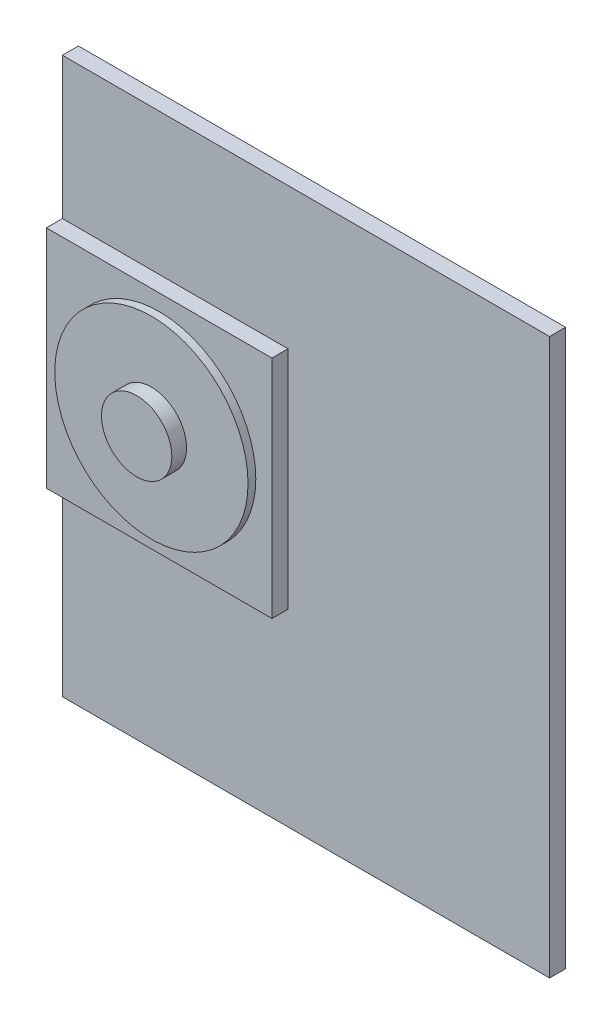
ISO-10303-21;
HEADER;
FILE_DESCRIPTION(('STEP AP214'),'2;1');
FILE_NAME('part.step','',(''),(''),'','','');
FILE_SCHEMA(('AUTOMOTIVE_DESIGN { 1 0 10303 214 1 1 1 1 }'));
ENDSEC;
DATA;
#1=APPLICATION_CONTEXT('core data for automotive mechanical design processes');
#2=APPLICATION_PROTOCOL_DEFINITION('international standard','automotive_design',2000,#1);
#3=PRODUCT_CONTEXT('',#1,'mechanical');
#4=PRODUCT('Part','Part','',(#3));
#5=PRODUCT_RELATED_PRODUCT_CATEGORY('part','',(#4));
#6=PRODUCT_DEFINITION_FORMATION('','',#4);
#7=PRODUCT_DEFINITION_CONTEXT('part definition',#1,'design');
#8=PRODUCT_DEFINITION('design','',#6,#7);
#9=PRODUCT_DEFINITION_SHAPE('','',#8);
#10=(LENGTH_UNIT() NAMED_UNIT(*) SI_UNIT(.MILLI.,.METRE.));
#11=(NAMED_UNIT(*) PLANE_ANGLE_UNIT() SI_UNIT($,.RADIAN.));
#12=(NAMED_UNIT(*) SI_UNIT($,.STERADIAN.) SOLID_ANGLE_UNIT());
#13=UNCERTAINTY_MEASURE_WITH_UNIT(LENGTH_MEASURE(1.E-05),#10,'distance_accuracy_value','');
#14=(GEOMETRIC_REPRESENTATION_CONTEXT(3) GLOBAL_UNCERTAINTY_ASSIGNED_CONTEXT((#13)) GLOBAL_UNIT_ASSIGNED_CONTEXT((#10,
#11,#12)) REPRESENTATION_CONTEXT('',''));
#15=CARTESIAN_POINT('',(0.,0.,0.));
#16=DIRECTION('',(0.,0.,1.));
#17=DIRECTION('',(1.,0.,0.));
#18=AXIS2_PLACEMENT_3D('',#15,#16,#17);
#19=CARTESIAN_POINT('',(-47.85,-47.85,6.8));
#20=DIRECTION('',(1.,0.,0.));
#21=DIRECTION('',(0.,0.,-1.));
#22=AXIS2_PLACEMENT_3D('',#19,#20,#21);
#23=PLANE('',#22);
#24=DIRECTION('',(0.,0.,-1.));
#25=VECTOR('',#24,1.);
#26=CARTESIAN_POINT('',(-47.85,47.85,6.8));
#27=LINE('',#26,#25);
#28=CARTESIAN_POINT('',(-47.85,47.85,6.8));
#29=VERTEX_POINT('',#28);
#30=CARTESIAN_POINT('',(-47.85,47.85,0.));
#31=VERTEX_POINT('',#30);
#32=EDGE_CURVE('E181',#29,#31,#27,.T.);
#33=ORIENTED_EDGE('',*,*,#32,.T.);
#34=DIRECTION('',(0.,-1.,0.));
#35=VECTOR('',#34,1.);
#36=CARTESIAN_POINT('',(-47.85,107.85,0.));
#37=LINE('',#36,#35);
#38=CARTESIAN_POINT('',(-47.85,107.85,0.));
#39=VERTEX_POINT('',#38);
#40=EDGE_CURVE('E115',#39,#31,#37,.T.);
#41=ORIENTED_EDGE('',*,*,#40,.F.);
#42=DIRECTION('',(0.,0.,1.));
#43=VECTOR('',#42,1.);
#44=CARTESIAN_POINT('',(-47.85,107.85,-6.8));
#45=LINE('',#44,#43);
#46=CARTESIAN_POINT('',(-47.85,107.85,-6.8));
#47=VERTEX_POINT('',#46);
#48=EDGE_CURVE('E110',#47,#39,#45,.T.);
#49=ORIENTED_EDGE('',*,*,#48,.F.);
#50=DIRECTION('',(0.,-1.,0.));
#51=VECTOR('',#50,1.);
#52=CARTESIAN_POINT('',(-47.85,107.85,-6.8));
#53=LINE('',#52,#51);
#54=CARTESIAN_POINT('',(-47.85,-127.85,-6.8));
#55=VERTEX_POINT('',#54);
#56=EDGE_CURVE('E114',#47,#55,#53,.T.);
#57=ORIENTED_EDGE('',*,*,#56,.T.);
#58=DIRECTION('',(0.,0.,1.));
#59=VECTOR('',#58,1.);
#60=CARTESIAN_POINT('',(-47.85,-127.85,-6.8));
#61=LINE('',#60,#59);
#62=CARTESIAN_POINT('',(-47.85,-127.85,0.));
#63=VERTEX_POINT('',#62);
#64=EDGE_CURVE('E121',#55,#63,#61,.T.);
#65=ORIENTED_EDGE('',*,*,#64,.T.);
#66=CARTESIAN_POINT('',(-47.85,-47.85,0.));
#67=VERTEX_POINT('',#66);
#68=EDGE_CURVE('E154',#67,#63,#37,.T.);
#69=ORIENTED_EDGE('',*,*,#68,.F.);
#70=DIRECTION('',(0.,0.,-1.));
#71=VECTOR('',#70,1.);
#72=CARTESIAN_POINT('',(-47.85,-47.85,6.8));
#73=LINE('',#72,#71);
#74=CARTESIAN_POINT('',(-47.85,-47.85,6.8));
#75=VERTEX_POINT('',#74);
#76=EDGE_CURVE('E50',#75,#67,#73,.T.);
#77=ORIENTED_EDGE('',*,*,#76,.F.);
#78=DIRECTION('',(0.,-1.,0.));
#79=VECTOR('',#78,1.);
#80=CARTESIAN_POINT('',(-47.85,-47.85,6.8));
#81=LINE('',#80,#79);
#82=EDGE_CURVE('E169',#29,#75,#81,.T.);
#83=ORIENTED_EDGE('',*,*,#82,.F.);
#84=EDGE_LOOP('',(#33,#41,#49,#57,#65,#69,#77,#83));
#85=FACE_BOUND('',#84,.T.);
#86=ADVANCED_FACE('F47',(#85),#23,.F.);
#87=CARTESIAN_POINT('',(47.85,-47.85,6.8));
#88=DIRECTION('',(0.,1.,0.));
#89=DIRECTION('',(-1.,0.,0.));
#90=AXIS2_PLACEMENT_3D('',#87,#88,#89);
#91=PLANE('',#90);
#92=DIRECTION('',(1.,0.,0.));
#93=VECTOR('',#92,1.);
#94=CARTESIAN_POINT('',(47.85,-47.85,0.));
#95=LINE('',#94,#93);
#96=CARTESIAN_POINT('',(47.85,-47.85,0.));
#97=VERTEX_POINT('',#96);
#98=EDGE_CURVE('E163',#67,#97,#95,.T.);
#99=ORIENTED_EDGE('',*,*,#98,.T.);
#100=DIRECTION('',(0.,0.,-1.));
#101=VECTOR('',#100,1.);
#102=CARTESIAN_POINT('',(47.85,-47.85,6.8));
#103=LINE('',#102,#101);
#104=CARTESIAN_POINT('',(47.85,-47.85,6.8));
#105=VERTEX_POINT('',#104);
#106=EDGE_CURVE('E197',#105,#97,#103,.T.);
#107=ORIENTED_EDGE('',*,*,#106,.F.);
#108=DIRECTION('',(1.,0.,0.));
#109=VECTOR('',#108,1.);
#110=CARTESIAN_POINT('',(47.85,-47.85,6.8));
#111=LINE('',#110,#109);
#112=EDGE_CURVE('E172',#75,#105,#111,.T.);
#113=ORIENTED_EDGE('',*,*,#112,.F.);
#114=ORIENTED_EDGE('',*,*,#76,.T.);
#115=EDGE_LOOP('',(#99,#107,#113,#114));
#116=FACE_BOUND('',#115,.T.);
#117=ADVANCED_FACE('F248',(#116),#91,.F.);
#118=CARTESIAN_POINT('',(47.85,-47.85,6.8));
#119=DIRECTION('',(-1.,0.,0.));
#120=DIRECTION('',(0.,0.,1.));
#121=AXIS2_PLACEMENT_3D('',#118,#119,#120);
#122=PLANE('',#121);
#123=DIRECTION('',(0.,1.,0.));
#124=VECTOR('',#123,1.);
#125=CARTESIAN_POINT('',(47.85,-47.85,0.));
#126=LINE('',#125,#124);
#127=CARTESIAN_POINT('',(47.85,47.85,0.));
#128=VERTEX_POINT('',#127);
#129=EDGE_CURVE('E185',#97,#128,#126,.T.);
#130=ORIENTED_EDGE('',*,*,#129,.T.);
#131=DIRECTION('',(0.,0.,-1.));
#132=VECTOR('',#131,1.);
#133=CARTESIAN_POINT('',(47.85,47.85,6.8));
#134=LINE('',#133,#132);
#135=CARTESIAN_POINT('',(47.85,47.85,6.8));
#136=VERTEX_POINT('',#135);
#137=EDGE_CURVE('E194',#136,#128,#134,.T.);
#138=ORIENTED_EDGE('',*,*,#137,.F.);
#139=DIRECTION('',(0.,1.,0.));
#140=VECTOR('',#139,1.);
#141=CARTESIAN_POINT('',(47.85,-47.85,6.8));
#142=LINE('',#141,#140);
#143=EDGE_CURVE('E176',#105,#136,#142,.T.);
#144=ORIENTED_EDGE('',*,*,#143,.F.);
#145=ORIENTED_EDGE('',*,*,#106,.T.);
#146=EDGE_LOOP('',(#130,#138,#144,#145));
#147=FACE_BOUND('',#146,.T.);
#148=ADVANCED_FACE('F252',(#147),#122,.F.);
#149=CARTESIAN_POINT('',(47.85,47.85,6.8));
#150=DIRECTION('',(0.,-1.,0.));
#151=DIRECTION('',(1.,0.,0.));
#152=AXIS2_PLACEMENT_3D('',#149,#150,#151);
#153=PLANE('',#152);
#154=DIRECTION('',(-1.,0.,0.));
#155=VECTOR('',#154,1.);
#156=CARTESIAN_POINT('',(47.85,47.85,0.));
#157=LINE('',#156,#155);
#158=EDGE_CURVE('E173',#128,#31,#157,.T.);
#159=ORIENTED_EDGE('',*,*,#158,.T.);
#160=ORIENTED_EDGE('',*,*,#32,.F.);
#161=DIRECTION('',(-1.,0.,0.));
#162=VECTOR('',#161,1.);
#163=CARTESIAN_POINT('',(47.85,47.85,6.8));
#164=LINE('',#163,#162);
#165=EDGE_CURVE('E65',#136,#29,#164,.T.);
#166=ORIENTED_EDGE('',*,*,#165,.F.);
#167=ORIENTED_EDGE('',*,*,#137,.T.);
#168=EDGE_LOOP('',(#159,#160,#166,#167));
#169=FACE_BOUND('',#168,.T.);
#170=ADVANCED_FACE('F216',(#169),#153,.F.);
#171=CARTESIAN_POINT('',(0.,0.,6.8));
#172=DIRECTION('',(0.,0.,1.));
#173=DIRECTION('',(1.,0.,0.));
#174=AXIS2_PLACEMENT_3D('',#171,#172,#173);
#175=PLANE('',#174);
#176=CARTESIAN_POINT('',(0.,0.,6.8));
#177=DIRECTION('',(0.,0.,1.));
#178=DIRECTION('',(1.,0.,0.));
#179=AXIS2_PLACEMENT_3D('',#176,#177,#178);
#180=CIRCLE('',#179,41.);
#181=CARTESIAN_POINT('',(41.,0.,6.8));
#182=VERTEX_POINT('',#181);
#183=EDGE_CURVE('E57',#182,#182,#180,.T.);
#184=ORIENTED_EDGE('',*,*,#183,.F.);
#185=EDGE_LOOP('',(#184));
#186=FACE_BOUND('',#185,.T.);
#187=ORIENTED_EDGE('',*,*,#82,.T.);
#188=ORIENTED_EDGE('',*,*,#112,.T.);
#189=ORIENTED_EDGE('',*,*,#143,.T.);
#190=ORIENTED_EDGE('',*,*,#165,.T.);
#191=EDGE_LOOP('',(#187,#188,#189,#190));
#192=FACE_BOUND('',#191,.T.);
#193=ADVANCED_FACE('F213',(#186,#192),#175,.T.);
#194=CARTESIAN_POINT('',(0.,0.,0.));
#195=DIRECTION('',(0.,0.,1.));
#196=DIRECTION('',(1.,0.,0.));
#197=AXIS2_PLACEMENT_3D('',#194,#195,#196);
#198=PLANE('',#197);
#199=ORIENTED_EDGE('',*,*,#158,.F.);
#200=ORIENTED_EDGE('',*,*,#129,.F.);
#201=ORIENTED_EDGE('',*,*,#98,.F.);
#202=ORIENTED_EDGE('',*,*,#68,.T.);
#203=DIRECTION('',(1.,0.,0.));
#204=VECTOR('',#203,1.);
#205=CARTESIAN_POINT('',(-47.85,-127.85,0.));
#206=LINE('',#205,#204);
#207=CARTESIAN_POINT('',(158.85,-127.85,0.));
#208=VERTEX_POINT('',#207);
#209=EDGE_CURVE('E142',#63,#208,#206,.T.);
#210=ORIENTED_EDGE('',*,*,#209,.T.);
#211=DIRECTION('',(0.,1.,0.));
#212=VECTOR('',#211,1.);
#213=CARTESIAN_POINT('',(158.85,-127.85,0.));
#214=LINE('',#213,#212);
#215=CARTESIAN_POINT('',(158.85,107.85,0.));
#216=VERTEX_POINT('',#215);
#217=EDGE_CURVE('E138',#208,#216,#214,.T.);
#218=ORIENTED_EDGE('',*,*,#217,.T.);
#219=DIRECTION('',(-1.,0.,0.));
#220=VECTOR('',#219,1.);
#221=CARTESIAN_POINT('',(158.85,107.85,0.));
#222=LINE('',#221,#220);
#223=EDGE_CURVE('E151',#216,#39,#222,.T.);
#224=ORIENTED_EDGE('',*,*,#223,.T.);
#225=ORIENTED_EDGE('',*,*,#40,.T.);
#226=EDGE_LOOP('',(#199,#200,#201,#202,#210,#218,#224,#225));
#227=FACE_BOUND('',#226,.T.);
#228=ADVANCED_FACE('F215',(#227),#198,.T.);
#229=CARTESIAN_POINT('',(158.85,107.85,-6.8));
#230=DIRECTION('',(0.,1.,0.));
#231=DIRECTION('',(-1.,0.,0.));
#232=AXIS2_PLACEMENT_3D('',#229,#230,#231);
#233=PLANE('',#232);
#234=ORIENTED_EDGE('',*,*,#223,.F.);
#235=DIRECTION('',(0.,0.,1.));
#236=VECTOR('',#235,1.);
#237=CARTESIAN_POINT('',(158.85,107.85,-6.8));
#238=LINE('',#237,#236);
#239=CARTESIAN_POINT('',(158.85,107.85,-6.8));
#240=VERTEX_POINT('',#239);
#241=EDGE_CURVE('E136',#240,#216,#238,.T.);
#242=ORIENTED_EDGE('',*,*,#241,.F.);
#243=DIRECTION('',(-1.,0.,0.));
#244=VECTOR('',#243,1.);
#245=CARTESIAN_POINT('',(158.85,107.85,-6.8));
#246=LINE('',#245,#244);
#247=EDGE_CURVE('E129',#240,#47,#246,.T.);
#248=ORIENTED_EDGE('',*,*,#247,.T.);
#249=ORIENTED_EDGE('',*,*,#48,.T.);
#250=EDGE_LOOP('',(#234,#242,#248,#249));
#251=FACE_BOUND('',#250,.T.);
#252=ADVANCED_FACE('F135',(#251),#233,.T.);
#253=CARTESIAN_POINT('',(158.85,-127.85,-6.8));
#254=DIRECTION('',(1.,0.,0.));
#255=DIRECTION('',(0.,0.,-1.));
#256=AXIS2_PLACEMENT_3D('',#253,#254,#255);
#257=PLANE('',#256);
#258=ORIENTED_EDGE('',*,*,#217,.F.);
#259=DIRECTION('',(0.,0.,1.));
#260=VECTOR('',#259,1.);
#261=CARTESIAN_POINT('',(158.85,-127.85,-6.8));
#262=LINE('',#261,#260);
#263=CARTESIAN_POINT('',(158.85,-127.85,-6.8));
#264=VERTEX_POINT('',#263);
#265=EDGE_CURVE('E164',#264,#208,#262,.T.);
#266=ORIENTED_EDGE('',*,*,#265,.F.);
#267=DIRECTION('',(0.,1.,0.));
#268=VECTOR('',#267,1.);
#269=CARTESIAN_POINT('',(158.85,-127.85,-6.8));
#270=LINE('',#269,#268);
#271=EDGE_CURVE('E122',#264,#240,#270,.T.);
#272=ORIENTED_EDGE('',*,*,#271,.T.);
#273=ORIENTED_EDGE('',*,*,#241,.T.);
#274=EDGE_LOOP('',(#258,#266,#272,#273));
#275=FACE_BOUND('',#274,.T.);
#276=ADVANCED_FACE('F264',(#275),#257,.T.);
#277=CARTESIAN_POINT('',(-47.85,-127.85,-6.8));
#278=DIRECTION('',(0.,-1.,0.));
#279=DIRECTION('',(0.,0.,-1.));
#280=AXIS2_PLACEMENT_3D('',#277,#278,#279);
#281=PLANE('',#280);
#282=ORIENTED_EDGE('',*,*,#209,.F.);
#283=ORIENTED_EDGE('',*,*,#64,.F.);
#284=DIRECTION('',(1.,0.,0.));
#285=VECTOR('',#284,1.);
#286=CARTESIAN_POINT('',(-47.85,-127.85,-6.8));
#287=LINE('',#286,#285);
#288=EDGE_CURVE('E132',#55,#264,#287,.T.);
#289=ORIENTED_EDGE('',*,*,#288,.T.);
#290=ORIENTED_EDGE('',*,*,#265,.T.);
#291=EDGE_LOOP('',(#282,#283,#289,#290));
#292=FACE_BOUND('',#291,.T.);
#293=ADVANCED_FACE('F245',(#292),#281,.T.);
#294=CARTESIAN_POINT('',(0.,0.,-6.8));
#295=DIRECTION('',(0.,0.,1.));
#296=DIRECTION('',(1.,0.,0.));
#297=AXIS2_PLACEMENT_3D('',#294,#295,#296);
#298=PLANE('',#297);
#299=ORIENTED_EDGE('',*,*,#247,.F.);
#300=ORIENTED_EDGE('',*,*,#271,.F.);
#301=ORIENTED_EDGE('',*,*,#288,.F.);
#302=ORIENTED_EDGE('',*,*,#56,.F.);
#303=EDGE_LOOP('',(#299,#300,#301,#302));
#304=FACE_BOUND('',#303,.T.);
#305=ADVANCED_FACE('F127',(#304),#298,.F.);
#306=CARTESIAN_POINT('',(0.,0.,10.1));
#307=DIRECTION('',(0.,0.,-1.));
#308=DIRECTION('',(-1.,0.,0.));
#309=AXIS2_PLACEMENT_3D('',#306,#307,#308);
#310=CYLINDRICAL_SURFACE('',#309,41.);
#311=CARTESIAN_POINT('',(0.,0.,10.1));
#312=DIRECTION('',(0.,0.,1.));
#313=DIRECTION('',(1.,0.,0.));
#314=AXIS2_PLACEMENT_3D('',#311,#312,#313);
#315=CIRCLE('',#314,41.);
#316=CARTESIAN_POINT('',(41.,0.,10.1));
#317=VERTEX_POINT('',#316);
#318=EDGE_CURVE('E155',#317,#317,#315,.T.);
#319=ORIENTED_EDGE('',*,*,#318,.F.);
#320=EDGE_LOOP('',(#319));
#321=FACE_BOUND('',#320,.T.);
#322=ORIENTED_EDGE('',*,*,#183,.T.);
#323=EDGE_LOOP('',(#322));
#324=FACE_BOUND('',#323,.T.);
#325=ADVANCED_FACE('F211',(#321,#324),#310,.T.);
#326=CARTESIAN_POINT('',(0.,0.,10.1));
#327=DIRECTION('',(0.,0.,1.));
#328=DIRECTION('',(1.,0.,0.));
#329=AXIS2_PLACEMENT_3D('',#326,#327,#328);
#330=PLANE('',#329);
#331=CARTESIAN_POINT('',(0.,0.,10.1));
#332=DIRECTION('',(0.,0.,1.));
#333=DIRECTION('',(1.,0.,0.));
#334=AXIS2_PLACEMENT_3D('',#331,#332,#333);
#335=CIRCLE('',#334,14.925);
#336=CARTESIAN_POINT('',(14.925,0.,10.1));
#337=VERTEX_POINT('',#336);
#338=EDGE_CURVE('E11',#337,#337,#335,.T.);
#339=ORIENTED_EDGE('',*,*,#338,.F.);
#340=EDGE_LOOP('',(#339));
#341=FACE_BOUND('',#340,.T.);
#342=ORIENTED_EDGE('',*,*,#318,.T.);
#343=EDGE_LOOP('',(#342));
#344=FACE_BOUND('',#343,.T.);
#345=ADVANCED_FACE('F233',(#341,#344),#330,.T.);
#346=CARTESIAN_POINT('',(0.,0.,16.35));
#347=DIRECTION('',(0.,0.,-1.));
#348=DIRECTION('',(-1.,0.,0.));
#349=AXIS2_PLACEMENT_3D('',#346,#347,#348);
#350=CYLINDRICAL_SURFACE('',#349,14.925);
#351=CARTESIAN_POINT('',(0.,0.,16.35));
#352=DIRECTION('',(0.,0.,1.));
#353=DIRECTION('',(1.,0.,0.));
#354=AXIS2_PLACEMENT_3D('',#351,#352,#353);
#355=CIRCLE('',#354,14.925);
#356=CARTESIAN_POINT('',(14.925,0.,16.35));
#357=VERTEX_POINT('',#356);
#358=EDGE_CURVE('E224',#357,#357,#355,.T.);
#359=ORIENTED_EDGE('',*,*,#358,.F.);
#360=EDGE_LOOP('',(#359));
#361=FACE_BOUND('',#360,.T.);
#362=ORIENTED_EDGE('',*,*,#338,.T.);
#363=EDGE_LOOP('',(#362));
#364=FACE_BOUND('',#363,.T.);
#365=ADVANCED_FACE('F241',(#361,#364),#350,.T.);
#366=CARTESIAN_POINT('',(0.,0.,16.35));
#367=DIRECTION('',(0.,0.,1.));
#368=DIRECTION('',(1.,0.,0.));
#369=AXIS2_PLACEMENT_3D('',#366,#367,#368);
#370=PLANE('',#369);
#371=ORIENTED_EDGE('',*,*,#358,.T.);
#372=EDGE_LOOP('',(#371));
#373=FACE_BOUND('',#372,.T.);
#374=ADVANCED_FACE('F346',(#373),#370,.T.);
#375=CLOSED_SHELL('',(#86,#117,#148,#170,#193,#228,#252,#276,#293,#305,#325,#345,#365,#374));
#376=MANIFOLD_SOLID_BREP('B2',#375);
#377=ADVANCED_BREP_SHAPE_REPRESENTATION('',(#18,#376),#14);
#378=SHAPE_DEFINITION_REPRESENTATION(#9,#377);
ENDSEC;
END-ISO-10303-21;
